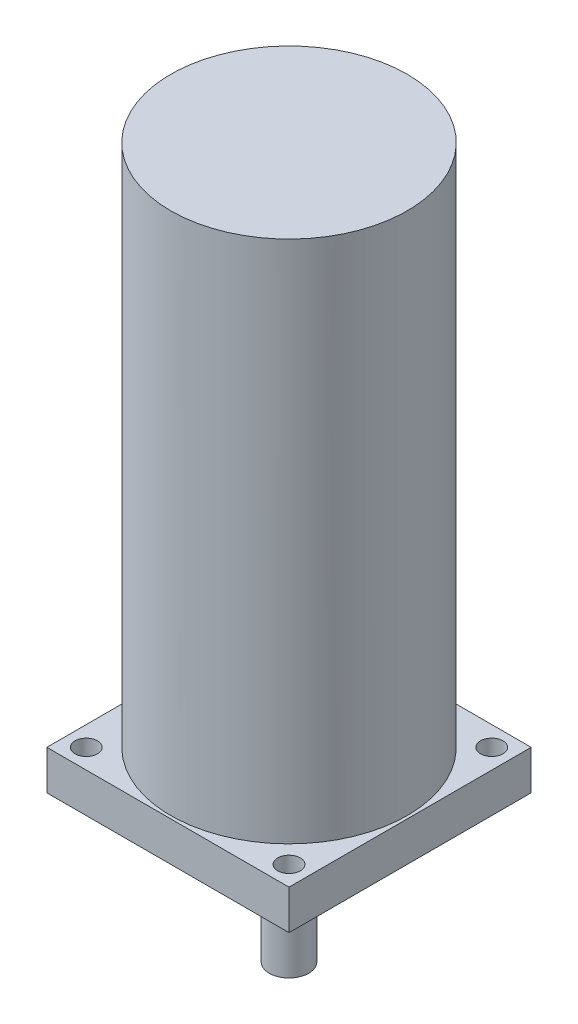
ISO-10303-21;
HEADER;
FILE_DESCRIPTION(('STEP AP214'),'2;1');
FILE_NAME('part.step','',(''),(''),'','','');
FILE_SCHEMA(('AUTOMOTIVE_DESIGN { 1 0 10303 214 1 1 1 1 }'));
ENDSEC;
DATA;
#1=APPLICATION_CONTEXT('core data for automotive mechanical design processes');
#2=APPLICATION_PROTOCOL_DEFINITION('international standard','automotive_design',2000,#1);
#3=PRODUCT_CONTEXT('',#1,'mechanical');
#4=PRODUCT('Part','Part','',(#3));
#5=PRODUCT_RELATED_PRODUCT_CATEGORY('part','',(#4));
#6=PRODUCT_DEFINITION_FORMATION('','',#4);
#7=PRODUCT_DEFINITION_CONTEXT('part definition',#1,'design');
#8=PRODUCT_DEFINITION('design','',#6,#7);
#9=PRODUCT_DEFINITION_SHAPE('','',#8);
#10=(LENGTH_UNIT() NAMED_UNIT(*) SI_UNIT(.MILLI.,.METRE.));
#11=(NAMED_UNIT(*) PLANE_ANGLE_UNIT() SI_UNIT($,.RADIAN.));
#12=(NAMED_UNIT(*) SI_UNIT($,.STERADIAN.) SOLID_ANGLE_UNIT());
#13=UNCERTAINTY_MEASURE_WITH_UNIT(LENGTH_MEASURE(1.E-05),#10,'distance_accuracy_value','');
#14=(GEOMETRIC_REPRESENTATION_CONTEXT(3) GLOBAL_UNCERTAINTY_ASSIGNED_CONTEXT((#13)) GLOBAL_UNIT_ASSIGNED_CONTEXT((#10,
#11,#12)) REPRESENTATION_CONTEXT('',''));
#15=CARTESIAN_POINT('',(0.,0.,0.));
#16=DIRECTION('',(0.,0.,1.));
#17=DIRECTION('',(1.,0.,0.));
#18=AXIS2_PLACEMENT_3D('',#15,#16,#17);
#19=CARTESIAN_POINT('',(0.,0.,0.));
#20=DIRECTION('',(0.,1.,0.));
#21=DIRECTION('',(0.,0.,1.));
#22=AXIS2_PLACEMENT_3D('',#19,#20,#21);
#23=PLANE('',#22);
#24=CARTESIAN_POINT('',(18.,0.,18.));
#25=DIRECTION('',(0.,1.,0.));
#26=DIRECTION('',(0.,0.,1.));
#27=AXIS2_PLACEMENT_3D('',#24,#25,#26);
#28=CIRCLE('',#27,2.);
#29=CARTESIAN_POINT('',(18.,0.,20.));
#30=VERTEX_POINT('',#29);
#31=EDGE_CURVE('E126',#30,#30,#28,.T.);
#32=ORIENTED_EDGE('',*,*,#31,.T.);
#33=EDGE_LOOP('',(#32));
#34=FACE_BOUND('',#33,.T.);
#35=CARTESIAN_POINT('',(18.,0.,-18.));
#36=DIRECTION('',(0.,1.,0.));
#37=DIRECTION('',(0.,0.,1.));
#38=AXIS2_PLACEMENT_3D('',#35,#36,#37);
#39=CIRCLE('',#38,2.);
#40=CARTESIAN_POINT('',(18.,0.,-16.));
#41=VERTEX_POINT('',#40);
#42=EDGE_CURVE('E171',#41,#41,#39,.T.);
#43=ORIENTED_EDGE('',*,*,#42,.T.);
#44=EDGE_LOOP('',(#43));
#45=FACE_BOUND('',#44,.T.);
#46=CARTESIAN_POINT('',(-18.,0.,-18.));
#47=DIRECTION('',(0.,1.,0.));
#48=DIRECTION('',(0.,0.,1.));
#49=AXIS2_PLACEMENT_3D('',#46,#47,#48);
#50=CIRCLE('',#49,2.);
#51=CARTESIAN_POINT('',(-18.,0.,-16.));
#52=VERTEX_POINT('',#51);
#53=EDGE_CURVE('E167',#52,#52,#50,.T.);
#54=ORIENTED_EDGE('',*,*,#53,.T.);
#55=EDGE_LOOP('',(#54));
#56=FACE_BOUND('',#55,.T.);
#57=CARTESIAN_POINT('',(-18.,0.,18.));
#58=DIRECTION('',(0.,1.,0.));
#59=DIRECTION('',(0.,0.,1.));
#60=AXIS2_PLACEMENT_3D('',#57,#58,#59);
#61=CIRCLE('',#60,2.);
#62=CARTESIAN_POINT('',(-18.,0.,20.));
#63=VERTEX_POINT('',#62);
#64=EDGE_CURVE('E163',#63,#63,#61,.T.);
#65=ORIENTED_EDGE('',*,*,#64,.T.);
#66=EDGE_LOOP('',(#65));
#67=FACE_BOUND('',#66,.T.);
#68=CARTESIAN_POINT('',(0.,0.,0.));
#69=DIRECTION('',(0.,1.,0.));
#70=DIRECTION('',(0.,0.,1.));
#71=AXIS2_PLACEMENT_3D('',#68,#69,#70);
#72=CIRCLE('',#71,7.);
#73=CARTESIAN_POINT('',(0.,0.,7.));
#74=VERTEX_POINT('',#73);
#75=EDGE_CURVE('E55',#74,#74,#72,.F.);
#76=ORIENTED_EDGE('',*,*,#75,.F.);
#77=EDGE_LOOP('',(#76));
#78=FACE_BOUND('',#77,.T.);
#79=DIRECTION('',(0.,0.,1.));
#80=VECTOR('',#79,1.);
#81=CARTESIAN_POINT('',(21.5,0.,21.5));
#82=LINE('',#81,#80);
#83=CARTESIAN_POINT('',(21.5,0.,-21.5));
#84=VERTEX_POINT('',#83);
#85=CARTESIAN_POINT('',(21.5,0.,21.5));
#86=VERTEX_POINT('',#85);
#87=EDGE_CURVE('E121',#84,#86,#82,.T.);
#88=ORIENTED_EDGE('',*,*,#87,.T.);
#89=DIRECTION('',(-1.,0.,0.));
#90=VECTOR('',#89,1.);
#91=CARTESIAN_POINT('',(-21.5,0.,21.5));
#92=LINE('',#91,#90);
#93=CARTESIAN_POINT('',(-21.5,0.,21.5));
#94=VERTEX_POINT('',#93);
#95=EDGE_CURVE('E125',#86,#94,#92,.T.);
#96=ORIENTED_EDGE('',*,*,#95,.T.);
#97=DIRECTION('',(0.,0.,-1.));
#98=VECTOR('',#97,1.);
#99=CARTESIAN_POINT('',(-21.5,0.,21.5));
#100=LINE('',#99,#98);
#101=CARTESIAN_POINT('',(-21.5,0.,-21.5));
#102=VERTEX_POINT('',#101);
#103=EDGE_CURVE('E100',#94,#102,#100,.T.);
#104=ORIENTED_EDGE('',*,*,#103,.T.);
#105=DIRECTION('',(1.,0.,0.));
#106=VECTOR('',#105,1.);
#107=CARTESIAN_POINT('',(-21.5,0.,-21.5));
#108=LINE('',#107,#106);
#109=EDGE_CURVE('E115',#102,#84,#108,.T.);
#110=ORIENTED_EDGE('',*,*,#109,.T.);
#111=EDGE_LOOP('',(#88,#96,#104,#110));
#112=FACE_BOUND('',#111,.T.);
#113=ADVANCED_FACE('F44',(#34,#45,#56,#67,#78,#112),#23,.F.);
#114=CARTESIAN_POINT('',(0.,-7.,0.));
#115=DIRECTION('',(0.,1.,0.));
#116=DIRECTION('',(0.,0.,1.));
#117=AXIS2_PLACEMENT_3D('',#114,#115,#116);
#118=CYLINDRICAL_SURFACE('',#117,7.);
#119=CARTESIAN_POINT('',(0.,-7.,0.));
#120=DIRECTION('',(0.,-1.,0.));
#121=DIRECTION('',(0.,0.,-1.));
#122=AXIS2_PLACEMENT_3D('',#119,#120,#121);
#123=CIRCLE('',#122,7.);
#124=CARTESIAN_POINT('',(0.,-7.,-7.));
#125=VERTEX_POINT('',#124);
#126=EDGE_CURVE('E136',#125,#125,#123,.T.);
#127=ORIENTED_EDGE('',*,*,#126,.F.);
#128=EDGE_LOOP('',(#127));
#129=FACE_BOUND('',#128,.T.);
#130=ORIENTED_EDGE('',*,*,#75,.T.);
#131=EDGE_LOOP('',(#130));
#132=FACE_BOUND('',#131,.T.);
#133=ADVANCED_FACE('F205',(#129,#132),#118,.T.);
#134=CARTESIAN_POINT('',(0.,-7.,0.));
#135=DIRECTION('',(0.,-1.,0.));
#136=DIRECTION('',(0.,0.,-1.));
#137=AXIS2_PLACEMENT_3D('',#134,#135,#136);
#138=PLANE('',#137);
#139=CARTESIAN_POINT('',(0.,-7.,0.));
#140=DIRECTION('',(0.,-1.,0.));
#141=DIRECTION('',(0.,0.,-1.));
#142=AXIS2_PLACEMENT_3D('',#139,#140,#141);
#143=CIRCLE('',#142,3.5);
#144=CARTESIAN_POINT('',(0.,-7.,3.5));
#145=VERTEX_POINT('',#144);
#146=EDGE_CURVE('E144',#145,#145,#143,.T.);
#147=ORIENTED_EDGE('',*,*,#146,.F.);
#148=EDGE_LOOP('',(#147));
#149=FACE_BOUND('',#148,.T.);
#150=ORIENTED_EDGE('',*,*,#126,.T.);
#151=EDGE_LOOP('',(#150));
#152=FACE_BOUND('',#151,.T.);
#153=ADVANCED_FACE('F211',(#149,#152),#138,.T.);
#154=CARTESIAN_POINT('',(0.,-26.,0.));
#155=DIRECTION('',(0.,-1.,0.));
#156=DIRECTION('',(0.,0.,-1.));
#157=AXIS2_PLACEMENT_3D('',#154,#155,#156);
#158=PLANE('',#157);
#159=CARTESIAN_POINT('',(0.,-26.,0.));
#160=DIRECTION('',(0.,-1.,0.));
#161=DIRECTION('',(0.,0.,-1.));
#162=AXIS2_PLACEMENT_3D('',#159,#160,#161);
#163=CIRCLE('',#162,3.5);
#164=CARTESIAN_POINT('',(0.,-26.,3.5));
#165=VERTEX_POINT('',#164);
#166=EDGE_CURVE('E145',#165,#165,#163,.T.);
#167=ORIENTED_EDGE('',*,*,#166,.T.);
#168=EDGE_LOOP('',(#167));
#169=FACE_BOUND('',#168,.T.);
#170=ADVANCED_FACE('F224',(#169),#158,.T.);
#171=CARTESIAN_POINT('',(0.,-26.,0.));
#172=DIRECTION('',(0.,1.,0.));
#173=DIRECTION('',(0.,0.,1.));
#174=AXIS2_PLACEMENT_3D('',#171,#172,#173);
#175=CYLINDRICAL_SURFACE('',#174,3.5);
#176=CARTESIAN_POINT('',(0.,-7.,3.5));
#177=CARTESIAN_POINT('',(0.,-7.19791666666667,3.5));
#178=CARTESIAN_POINT('',(0.,-7.39583333333333,3.5));
#179=CARTESIAN_POINT('',(0.,-7.79166666666667,3.5));
#180=CARTESIAN_POINT('',(0.,-7.98958333333333,3.5));
#181=CARTESIAN_POINT('',(0.,-8.38541666666667,3.5));
#182=CARTESIAN_POINT('',(0.,-8.58333333333333,3.5));
#183=CARTESIAN_POINT('',(0.,-8.97916666666666,3.5));
#184=CARTESIAN_POINT('',(0.,-9.17708333333333,3.5));
#185=CARTESIAN_POINT('',(0.,-9.57291666666667,3.5));
#186=CARTESIAN_POINT('',(0.,-9.77083333333333,3.5));
#187=CARTESIAN_POINT('',(0.,-10.1666666666667,3.5));
#188=CARTESIAN_POINT('',(0.,-10.3645833333333,3.5));
#189=CARTESIAN_POINT('',(0.,-10.7604166666667,3.5));
#190=CARTESIAN_POINT('',(0.,-10.9583333333333,3.5));
#191=CARTESIAN_POINT('',(0.,-11.3541666666667,3.5));
#192=CARTESIAN_POINT('',(0.,-11.5520833333333,3.5));
#193=CARTESIAN_POINT('',(0.,-11.9479166666667,3.5));
#194=CARTESIAN_POINT('',(0.,-12.1458333333333,3.5));
#195=CARTESIAN_POINT('',(0.,-12.5416666666667,3.5));
#196=CARTESIAN_POINT('',(0.,-12.7395833333333,3.5));
#197=CARTESIAN_POINT('',(0.,-13.1354166666667,3.5));
#198=CARTESIAN_POINT('',(0.,-13.3333333333333,3.5));
#199=CARTESIAN_POINT('',(0.,-13.7291666666667,3.5));
#200=CARTESIAN_POINT('',(0.,-13.9270833333333,3.5));
#201=CARTESIAN_POINT('',(0.,-14.3229166666667,3.5));
#202=CARTESIAN_POINT('',(0.,-14.5208333333333,3.5));
#203=CARTESIAN_POINT('',(0.,-14.9166666666667,3.5));
#204=CARTESIAN_POINT('',(0.,-15.1145833333333,3.5));
#205=CARTESIAN_POINT('',(0.,-15.5104166666667,3.5));
#206=CARTESIAN_POINT('',(0.,-15.7083333333333,3.5));
#207=CARTESIAN_POINT('',(0.,-16.1041666666667,3.5));
#208=CARTESIAN_POINT('',(0.,-16.3020833333333,3.5));
#209=CARTESIAN_POINT('',(0.,-16.6979166666667,3.5));
#210=CARTESIAN_POINT('',(0.,-16.8958333333333,3.5));
#211=CARTESIAN_POINT('',(0.,-17.2916666666667,3.5));
#212=CARTESIAN_POINT('',(0.,-17.4895833333333,3.5));
#213=CARTESIAN_POINT('',(0.,-17.8854166666667,3.5));
#214=CARTESIAN_POINT('',(0.,-18.0833333333333,3.5));
#215=CARTESIAN_POINT('',(0.,-18.4791666666667,3.5));
#216=CARTESIAN_POINT('',(0.,-18.6770833333333,3.5));
#217=CARTESIAN_POINT('',(0.,-19.0729166666667,3.5));
#218=CARTESIAN_POINT('',(0.,-19.2708333333333,3.5));
#219=CARTESIAN_POINT('',(0.,-19.6666666666667,3.5));
#220=CARTESIAN_POINT('',(0.,-19.8645833333333,3.5));
#221=CARTESIAN_POINT('',(0.,-20.2604166666667,3.5));
#222=CARTESIAN_POINT('',(0.,-20.4583333333333,3.5));
#223=CARTESIAN_POINT('',(0.,-20.8541666666667,3.5));
#224=CARTESIAN_POINT('',(0.,-21.0520833333333,3.5));
#225=CARTESIAN_POINT('',(0.,-21.4479166666667,3.5));
#226=CARTESIAN_POINT('',(0.,-21.6458333333333,3.5));
#227=CARTESIAN_POINT('',(0.,-22.0416666666667,3.5));
#228=CARTESIAN_POINT('',(0.,-22.2395833333333,3.5));
#229=CARTESIAN_POINT('',(0.,-22.6354166666667,3.5));
#230=CARTESIAN_POINT('',(0.,-22.8333333333333,3.5));
#231=CARTESIAN_POINT('',(0.,-23.2291666666667,3.5));
#232=CARTESIAN_POINT('',(0.,-23.4270833333333,3.5));
#233=CARTESIAN_POINT('',(0.,-23.8229166666667,3.5));
#234=CARTESIAN_POINT('',(0.,-24.0208333333333,3.5));
#235=CARTESIAN_POINT('',(0.,-24.4166666666667,3.5));
#236=CARTESIAN_POINT('',(0.,-24.6145833333333,3.5));
#237=CARTESIAN_POINT('',(0.,-25.0104166666667,3.5));
#238=CARTESIAN_POINT('',(0.,-25.2083333333333,3.5));
#239=CARTESIAN_POINT('',(0.,-25.6041666666667,3.5));
#240=CARTESIAN_POINT('',(0.,-25.8020833333333,3.5));
#241=CARTESIAN_POINT('',(0.,-26.,3.5));
#242=B_SPLINE_CURVE_WITH_KNOTS('',3,(#176,#177,#178,#179,#180,#181,#182,#183,#184,#185,#186,
#187,#188,#189,#190,#191,#192,#193,#194,#195,#196,#197,#198,#199,#200,#201,#202,#203,#204,#205,
#206,#207,#208,#209,#210,#211,#212,#213,#214,#215,#216,#217,#218,#219,#220,#221,#222,#223,#224,
#225,#226,#227,#228,#229,#230,#231,#232,#233,#234,#235,#236,#237,#238,#239,#240,#241),
.UNSPECIFIED.,.F.,.F.,(4,2,2,2,2,2,2,2,2,2,2,2,2,2,2,2,2,2,2,2,2,2,2,2,2,2,2,2,2,2,2,2,4),(0.,
0.593750000000001,1.1875,1.78125,2.375,2.96875,3.5625,4.15625,4.75,5.34375,5.9375,6.53125,7.125,
7.71875,8.3125,8.90625,9.5,10.09375,10.6875,11.28125,11.875,12.46875,13.0625,13.65625,14.25,
14.84375,15.4375,16.03125,16.625,17.21875,17.8125,18.40625,19.),.UNSPECIFIED.);
#243=EDGE_CURVE('BSEAM220',#145,#165,#242,.T.);
#244=ORIENTED_EDGE('',*,*,#146,.T.);
#245=ORIENTED_EDGE('',*,*,#166,.F.);
#246=ORIENTED_EDGE('',*,*,#243,.T.);
#247=ORIENTED_EDGE('',*,*,#243,.F.);
#248=EDGE_LOOP('',(#244,#246,#245,#247));
#249=FACE_BOUND('',#248,.T.);
#250=ADVANCED_FACE('F220',(#249),#175,.T.);
#251=CARTESIAN_POINT('',(21.5,7.,21.5));
#252=DIRECTION('',(1.,0.,0.));
#253=DIRECTION('',(0.,0.,-1.));
#254=AXIS2_PLACEMENT_3D('',#251,#252,#253);
#255=PLANE('',#254);
#256=ORIENTED_EDGE('',*,*,#87,.F.);
#257=DIRECTION('',(0.,-1.,0.));
#258=VECTOR('',#257,1.);
#259=CARTESIAN_POINT('',(21.5,7.,-21.5));
#260=LINE('',#259,#258);
#261=CARTESIAN_POINT('',(21.5,7.,-21.5));
#262=VERTEX_POINT('',#261);
#263=EDGE_CURVE('E64',#262,#84,#260,.T.);
#264=ORIENTED_EDGE('',*,*,#263,.F.);
#265=DIRECTION('',(0.,0.,1.));
#266=VECTOR('',#265,1.);
#267=CARTESIAN_POINT('',(21.5,7.,21.5));
#268=LINE('',#267,#266);
#269=CARTESIAN_POINT('',(21.5,7.,21.5));
#270=VERTEX_POINT('',#269);
#271=EDGE_CURVE('E112',#262,#270,#268,.T.);
#272=ORIENTED_EDGE('',*,*,#271,.T.);
#273=DIRECTION('',(0.,-1.,0.));
#274=VECTOR('',#273,1.);
#275=CARTESIAN_POINT('',(21.5,7.,21.5));
#276=LINE('',#275,#274);
#277=EDGE_CURVE('E92',#270,#86,#276,.T.);
#278=ORIENTED_EDGE('',*,*,#277,.T.);
#279=EDGE_LOOP('',(#256,#264,#272,#278));
#280=FACE_BOUND('',#279,.T.);
#281=ADVANCED_FACE('F223',(#280),#255,.T.);
#282=CARTESIAN_POINT('',(-21.5,7.,-21.5));
#283=DIRECTION('',(0.,0.,-1.));
#284=DIRECTION('',(-1.,0.,0.));
#285=AXIS2_PLACEMENT_3D('',#282,#283,#284);
#286=PLANE('',#285);
#287=ORIENTED_EDGE('',*,*,#109,.F.);
#288=DIRECTION('',(0.,-1.,0.));
#289=VECTOR('',#288,1.);
#290=CARTESIAN_POINT('',(-21.5,7.,-21.5));
#291=LINE('',#290,#289);
#292=CARTESIAN_POINT('',(-21.5,7.,-21.5));
#293=VERTEX_POINT('',#292);
#294=EDGE_CURVE('E81',#293,#102,#291,.T.);
#295=ORIENTED_EDGE('',*,*,#294,.F.);
#296=DIRECTION('',(1.,0.,0.));
#297=VECTOR('',#296,1.);
#298=CARTESIAN_POINT('',(-21.5,7.,-21.5));
#299=LINE('',#298,#297);
#300=EDGE_CURVE('E107',#293,#262,#299,.T.);
#301=ORIENTED_EDGE('',*,*,#300,.T.);
#302=ORIENTED_EDGE('',*,*,#263,.T.);
#303=EDGE_LOOP('',(#287,#295,#301,#302));
#304=FACE_BOUND('',#303,.T.);
#305=ADVANCED_FACE('F234',(#304),#286,.T.);
#306=CARTESIAN_POINT('',(-21.5,7.,21.5));
#307=DIRECTION('',(-1.,0.,0.));
#308=DIRECTION('',(0.,0.,1.));
#309=AXIS2_PLACEMENT_3D('',#306,#307,#308);
#310=PLANE('',#309);
#311=ORIENTED_EDGE('',*,*,#103,.F.);
#312=DIRECTION('',(0.,-1.,0.));
#313=VECTOR('',#312,1.);
#314=CARTESIAN_POINT('',(-21.5,7.,21.5));
#315=LINE('',#314,#313);
#316=CARTESIAN_POINT('',(-21.5,7.,21.5));
#317=VERTEX_POINT('',#316);
#318=EDGE_CURVE('E95',#317,#94,#315,.T.);
#319=ORIENTED_EDGE('',*,*,#318,.F.);
#320=DIRECTION('',(0.,0.,-1.));
#321=VECTOR('',#320,1.);
#322=CARTESIAN_POINT('',(-21.5,7.,21.5));
#323=LINE('',#322,#321);
#324=EDGE_CURVE('E98',#317,#293,#323,.T.);
#325=ORIENTED_EDGE('',*,*,#324,.T.);
#326=ORIENTED_EDGE('',*,*,#294,.T.);
#327=EDGE_LOOP('',(#311,#319,#325,#326));
#328=FACE_BOUND('',#327,.T.);
#329=ADVANCED_FACE('F97',(#328),#310,.T.);
#330=CARTESIAN_POINT('',(-21.5,7.,21.5));
#331=DIRECTION('',(0.,0.,1.));
#332=DIRECTION('',(1.,0.,0.));
#333=AXIS2_PLACEMENT_3D('',#330,#331,#332);
#334=PLANE('',#333);
#335=ORIENTED_EDGE('',*,*,#95,.F.);
#336=ORIENTED_EDGE('',*,*,#277,.F.);
#337=DIRECTION('',(-1.,0.,0.));
#338=VECTOR('',#337,1.);
#339=CARTESIAN_POINT('',(-21.5,7.,21.5));
#340=LINE('',#339,#338);
#341=EDGE_CURVE('E106',#270,#317,#340,.T.);
#342=ORIENTED_EDGE('',*,*,#341,.T.);
#343=ORIENTED_EDGE('',*,*,#318,.T.);
#344=EDGE_LOOP('',(#335,#336,#342,#343));
#345=FACE_BOUND('',#344,.T.);
#346=ADVANCED_FACE('F110',(#345),#334,.T.);
#347=CARTESIAN_POINT('',(0.,7.,0.));
#348=DIRECTION('',(0.,-1.,0.));
#349=DIRECTION('',(0.,0.,-1.));
#350=AXIS2_PLACEMENT_3D('',#347,#348,#349);
#351=PLANE('',#350);
#352=CARTESIAN_POINT('',(18.,7.00000000000001,18.));
#353=DIRECTION('',(0.,-1.,0.));
#354=DIRECTION('',(0.,0.,-1.));
#355=AXIS2_PLACEMENT_3D('',#352,#353,#354);
#356=CIRCLE('',#355,2.);
#357=CARTESIAN_POINT('',(18.,7.00000000000001,16.));
#358=VERTEX_POINT('',#357);
#359=EDGE_CURVE('E48',#358,#358,#356,.T.);
#360=ORIENTED_EDGE('',*,*,#359,.T.);
#361=EDGE_LOOP('',(#360));
#362=FACE_BOUND('',#361,.T.);
#363=CARTESIAN_POINT('',(18.,7.00000000000001,-18.));
#364=DIRECTION('',(0.,-1.,0.));
#365=DIRECTION('',(0.,0.,-1.));
#366=AXIS2_PLACEMENT_3D('',#363,#364,#365);
#367=CIRCLE('',#366,2.);
#368=CARTESIAN_POINT('',(18.,7.00000000000001,-20.));
#369=VERTEX_POINT('',#368);
#370=EDGE_CURVE('E168',#369,#369,#367,.T.);
#371=ORIENTED_EDGE('',*,*,#370,.T.);
#372=EDGE_LOOP('',(#371));
#373=FACE_BOUND('',#372,.T.);
#374=CARTESIAN_POINT('',(-18.,7.00000000000001,-18.));
#375=DIRECTION('',(0.,-1.,0.));
#376=DIRECTION('',(0.,0.,-1.));
#377=AXIS2_PLACEMENT_3D('',#374,#375,#376);
#378=CIRCLE('',#377,2.);
#379=CARTESIAN_POINT('',(-18.,7.00000000000001,-20.));
#380=VERTEX_POINT('',#379);
#381=EDGE_CURVE('E164',#380,#380,#378,.T.);
#382=ORIENTED_EDGE('',*,*,#381,.T.);
#383=EDGE_LOOP('',(#382));
#384=FACE_BOUND('',#383,.T.);
#385=CARTESIAN_POINT('',(-18.,7.00000000000001,18.));
#386=DIRECTION('',(0.,-1.,0.));
#387=DIRECTION('',(0.,0.,-1.));
#388=AXIS2_PLACEMENT_3D('',#385,#386,#387);
#389=CIRCLE('',#388,2.);
#390=CARTESIAN_POINT('',(-18.,7.00000000000001,16.));
#391=VERTEX_POINT('',#390);
#392=EDGE_CURVE('E159',#391,#391,#389,.T.);
#393=ORIENTED_EDGE('',*,*,#392,.T.);
#394=EDGE_LOOP('',(#393));
#395=FACE_BOUND('',#394,.T.);
#396=CARTESIAN_POINT('',(0.,7.00000000000001,0.));
#397=DIRECTION('',(0.,-1.,0.));
#398=DIRECTION('',(0.,0.,-1.));
#399=AXIS2_PLACEMENT_3D('',#396,#397,#398);
#400=CIRCLE('',#399,21.);
#401=CARTESIAN_POINT('',(0.,7.00000000000001,-21.));
#402=VERTEX_POINT('',#401);
#403=EDGE_CURVE('E11',#402,#402,#400,.T.);
#404=ORIENTED_EDGE('',*,*,#403,.T.);
#405=EDGE_LOOP('',(#404));
#406=FACE_BOUND('',#405,.T.);
#407=ORIENTED_EDGE('',*,*,#271,.F.);
#408=ORIENTED_EDGE('',*,*,#300,.F.);
#409=ORIENTED_EDGE('',*,*,#324,.F.);
#410=ORIENTED_EDGE('',*,*,#341,.F.);
#411=EDGE_LOOP('',(#407,#408,#409,#410));
#412=FACE_BOUND('',#411,.T.);
#413=ADVANCED_FACE('F105',(#362,#373,#384,#395,#406,#412),#351,.F.);
#414=CARTESIAN_POINT('',(0.,100.,0.));
#415=DIRECTION('',(0.,1.,0.));
#416=DIRECTION('',(0.,0.,1.));
#417=AXIS2_PLACEMENT_3D('',#414,#415,#416);
#418=PLANE('',#417);
#419=CARTESIAN_POINT('',(0.,100.,0.));
#420=DIRECTION('',(0.,1.,0.));
#421=DIRECTION('',(0.,0.,1.));
#422=AXIS2_PLACEMENT_3D('',#419,#420,#421);
#423=CIRCLE('',#422,21.);
#424=CARTESIAN_POINT('',(0.,100.,21.));
#425=VERTEX_POINT('',#424);
#426=EDGE_CURVE('E149',#425,#425,#423,.T.);
#427=ORIENTED_EDGE('',*,*,#426,.T.);
#428=EDGE_LOOP('',(#427));
#429=FACE_BOUND('',#428,.T.);
#430=ADVANCED_FACE('F216',(#429),#418,.T.);
#431=CARTESIAN_POINT('',(0.,100.,0.));
#432=DIRECTION('',(0.,-1.,0.));
#433=DIRECTION('',(0.,0.,-1.));
#434=AXIS2_PLACEMENT_3D('',#431,#432,#433);
#435=CYLINDRICAL_SURFACE('',#434,21.);
#436=ORIENTED_EDGE('',*,*,#426,.F.);
#437=EDGE_LOOP('',(#436));
#438=FACE_BOUND('',#437,.T.);
#439=ORIENTED_EDGE('',*,*,#403,.F.);
#440=EDGE_LOOP('',(#439));
#441=FACE_BOUND('',#440,.T.);
#442=ADVANCED_FACE('F46',(#438,#441),#435,.T.);
#443=CARTESIAN_POINT('',(-18.,100.,18.));
#444=DIRECTION('',(0.,-1.,0.));
#445=DIRECTION('',(0.,0.,-1.));
#446=AXIS2_PLACEMENT_3D('',#443,#444,#445);
#447=CYLINDRICAL_SURFACE('',#446,2.);
#448=ORIENTED_EDGE('',*,*,#392,.F.);
#449=EDGE_LOOP('',(#448));
#450=FACE_BOUND('',#449,.T.);
#451=ORIENTED_EDGE('',*,*,#64,.F.);
#452=EDGE_LOOP('',(#451));
#453=FACE_BOUND('',#452,.T.);
#454=ADVANCED_FACE('F241',(#450,#453),#447,.F.);
#455=CARTESIAN_POINT('',(-18.,100.,-18.));
#456=DIRECTION('',(0.,-1.,0.));
#457=DIRECTION('',(0.,0.,-1.));
#458=AXIS2_PLACEMENT_3D('',#455,#456,#457);
#459=CYLINDRICAL_SURFACE('',#458,2.);
#460=ORIENTED_EDGE('',*,*,#381,.F.);
#461=EDGE_LOOP('',(#460));
#462=FACE_BOUND('',#461,.T.);
#463=ORIENTED_EDGE('',*,*,#53,.F.);
#464=EDGE_LOOP('',(#463));
#465=FACE_BOUND('',#464,.T.);
#466=ADVANCED_FACE('F200',(#462,#465),#459,.F.);
#467=CARTESIAN_POINT('',(18.,100.,-18.));
#468=DIRECTION('',(0.,-1.,0.));
#469=DIRECTION('',(0.,0.,-1.));
#470=AXIS2_PLACEMENT_3D('',#467,#468,#469);
#471=CYLINDRICAL_SURFACE('',#470,2.);
#472=ORIENTED_EDGE('',*,*,#370,.F.);
#473=EDGE_LOOP('',(#472));
#474=FACE_BOUND('',#473,.T.);
#475=ORIENTED_EDGE('',*,*,#42,.F.);
#476=EDGE_LOOP('',(#475));
#477=FACE_BOUND('',#476,.T.);
#478=ADVANCED_FACE('F195',(#474,#477),#471,.F.);
#479=CARTESIAN_POINT('',(18.,100.,18.));
#480=DIRECTION('',(0.,-1.,0.));
#481=DIRECTION('',(0.,0.,-1.));
#482=AXIS2_PLACEMENT_3D('',#479,#480,#481);
#483=CYLINDRICAL_SURFACE('',#482,2.);
#484=ORIENTED_EDGE('',*,*,#359,.F.);
#485=EDGE_LOOP('',(#484));
#486=FACE_BOUND('',#485,.T.);
#487=ORIENTED_EDGE('',*,*,#31,.F.);
#488=EDGE_LOOP('',(#487));
#489=FACE_BOUND('',#488,.T.);
#490=ADVANCED_FACE('F192',(#486,#489),#483,.F.);
#491=CLOSED_SHELL('',(#113,#133,#153,#170,#250,#281,#305,#329,#346,#413,#430,#442,#454,#466,
#478,#490));
#492=MANIFOLD_SOLID_BREP('B2',#491);
#493=ADVANCED_BREP_SHAPE_REPRESENTATION('',(#18,#492),#14);
#494=SHAPE_DEFINITION_REPRESENTATION(#9,#493);
ENDSEC;
END-ISO-10303-21;
